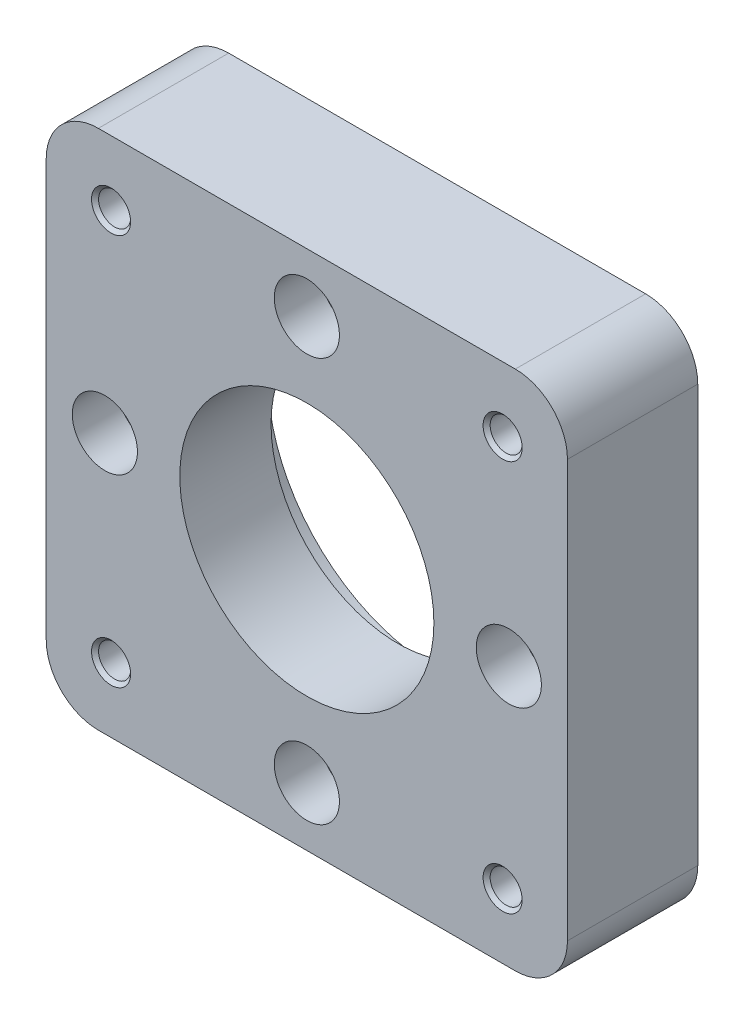
ISO-10303-21;
HEADER;
FILE_DESCRIPTION(('STEP AP214'),'2;1');
FILE_NAME('part.step','',(''),(''),'','','');
FILE_SCHEMA(('AUTOMOTIVE_DESIGN { 1 0 10303 214 1 1 1 1 }'));
ENDSEC;
DATA;
#1=APPLICATION_CONTEXT('core data for automotive mechanical design processes');
#2=APPLICATION_PROTOCOL_DEFINITION('international standard','automotive_design',2000,#1);
#3=PRODUCT_CONTEXT('',#1,'mechanical');
#4=PRODUCT('Part','Part','',(#3));
#5=PRODUCT_RELATED_PRODUCT_CATEGORY('part','',(#4));
#6=PRODUCT_DEFINITION_FORMATION('','',#4);
#7=PRODUCT_DEFINITION_CONTEXT('part definition',#1,'design');
#8=PRODUCT_DEFINITION('design','',#6,#7);
#9=PRODUCT_DEFINITION_SHAPE('','',#8);
#10=(LENGTH_UNIT() NAMED_UNIT(*) SI_UNIT(.MILLI.,.METRE.));
#11=(NAMED_UNIT(*) PLANE_ANGLE_UNIT() SI_UNIT($,.RADIAN.));
#12=(NAMED_UNIT(*) SI_UNIT($,.STERADIAN.) SOLID_ANGLE_UNIT());
#13=UNCERTAINTY_MEASURE_WITH_UNIT(LENGTH_MEASURE(1.E-05),#10,'distance_accuracy_value','');
#14=(GEOMETRIC_REPRESENTATION_CONTEXT(3) GLOBAL_UNCERTAINTY_ASSIGNED_CONTEXT((#13)) GLOBAL_UNIT_ASSIGNED_CONTEXT((#10,
#11,#12)) REPRESENTATION_CONTEXT('',''));
#15=CARTESIAN_POINT('',(0.,0.,0.));
#16=DIRECTION('',(0.,0.,1.));
#17=DIRECTION('',(1.,0.,0.));
#18=AXIS2_PLACEMENT_3D('',#15,#16,#17);
#19=CARTESIAN_POINT('',(-40.,-32.,-20.));
#20=DIRECTION('',(-1.,0.,0.));
#21=DIRECTION('',(0.,0.,1.));
#22=AXIS2_PLACEMENT_3D('',#19,#20,#21);
#23=PLANE('',#22);
#24=DIRECTION('',(0.,1.,0.));
#25=VECTOR('',#24,1.);
#26=CARTESIAN_POINT('',(-40.,-32.,0.));
#27=LINE('',#26,#25);
#28=CARTESIAN_POINT('',(-40.,32.,0.));
#29=VERTEX_POINT('',#28);
#30=CARTESIAN_POINT('',(-40.,-32.,0.));
#31=VERTEX_POINT('',#30);
#32=EDGE_CURVE('E83',#29,#31,#27,.F.);
#33=ORIENTED_EDGE('',*,*,#32,.F.);
#34=DIRECTION('',(0.,0.,-1.));
#35=VECTOR('',#34,1.);
#36=CARTESIAN_POINT('',(-40.,32.,0.));
#37=LINE('',#36,#35);
#38=CARTESIAN_POINT('',(-40.,32.,-20.));
#39=VERTEX_POINT('',#38);
#40=EDGE_CURVE('E95',#39,#29,#37,.F.);
#41=ORIENTED_EDGE('',*,*,#40,.F.);
#42=DIRECTION('',(0.,-1.,0.));
#43=VECTOR('',#42,1.);
#44=CARTESIAN_POINT('',(-40.,32.,-20.));
#45=LINE('',#44,#43);
#46=CARTESIAN_POINT('',(-40.,-32.,-20.));
#47=VERTEX_POINT('',#46);
#48=EDGE_CURVE('E100',#39,#47,#45,.T.);
#49=ORIENTED_EDGE('',*,*,#48,.T.);
#50=DIRECTION('',(0.,0.,1.));
#51=VECTOR('',#50,1.);
#52=CARTESIAN_POINT('',(-40.,-32.,-20.));
#53=LINE('',#52,#51);
#54=EDGE_CURVE('E97',#47,#31,#53,.T.);
#55=ORIENTED_EDGE('',*,*,#54,.T.);
#56=EDGE_LOOP('',(#33,#41,#49,#55));
#57=FACE_BOUND('',#56,.T.);
#58=ADVANCED_FACE('F17',(#57),#23,.T.);
#59=CARTESIAN_POINT('',(-31.9999999999987,-31.9999999999987,-20.));
#60=DIRECTION('',(0.,0.,1.));
#61=DIRECTION('',(-1.,-1.61526007705508E-13,0.));
#62=AXIS2_PLACEMENT_3D('',#59,#60,#61);
#63=CYLINDRICAL_SURFACE('',#62,8.00000000000131);
#64=CARTESIAN_POINT('',(-31.9999999999987,-31.9999999999987,0.));
#65=DIRECTION('',(0.,0.,-1.));
#66=DIRECTION('',(-1.62092561595246E-13,-1.,0.));
#67=AXIS2_PLACEMENT_3D('',#64,#65,#66);
#68=CIRCLE('',#67,8.00000000000131);
#69=CARTESIAN_POINT('',(-32.,-40.,0.));
#70=VERTEX_POINT('',#69);
#71=EDGE_CURVE('E111',#31,#70,#68,.F.);
#72=ORIENTED_EDGE('',*,*,#71,.F.);
#73=ORIENTED_EDGE('',*,*,#54,.F.);
#74=CARTESIAN_POINT('',(-31.9999999999987,-31.9999999999987,-20.));
#75=DIRECTION('',(0.,0.,1.));
#76=DIRECTION('',(-1.,-1.61648472385396E-13,0.));
#77=AXIS2_PLACEMENT_3D('',#74,#75,#76);
#78=CIRCLE('',#77,8.00000000000131);
#79=CARTESIAN_POINT('',(-32.,-40.,-20.));
#80=VERTEX_POINT('',#79);
#81=EDGE_CURVE('E115',#47,#80,#78,.T.);
#82=ORIENTED_EDGE('',*,*,#81,.T.);
#83=DIRECTION('',(0.,0.,1.));
#84=VECTOR('',#83,1.);
#85=CARTESIAN_POINT('',(-32.,-40.,-20.));
#86=LINE('',#85,#84);
#87=EDGE_CURVE('E120',#80,#70,#86,.T.);
#88=ORIENTED_EDGE('',*,*,#87,.T.);
#89=EDGE_LOOP('',(#72,#73,#82,#88));
#90=FACE_BOUND('',#89,.T.);
#91=ADVANCED_FACE('F345',(#90),#63,.T.);
#92=CARTESIAN_POINT('',(-32.,-40.,0.));
#93=DIRECTION('',(0.,-1.,0.));
#94=DIRECTION('',(0.,0.,-1.));
#95=AXIS2_PLACEMENT_3D('',#92,#93,#94);
#96=PLANE('',#95);
#97=DIRECTION('',(-1.,0.,0.));
#98=VECTOR('',#97,1.);
#99=CARTESIAN_POINT('',(32.,-40.,0.));
#100=LINE('',#99,#98);
#101=CARTESIAN_POINT('',(32.,-40.,0.));
#102=VERTEX_POINT('',#101);
#103=EDGE_CURVE('E125',#70,#102,#100,.F.);
#104=ORIENTED_EDGE('',*,*,#103,.F.);
#105=ORIENTED_EDGE('',*,*,#87,.F.);
#106=DIRECTION('',(1.,0.,0.));
#107=VECTOR('',#106,1.);
#108=CARTESIAN_POINT('',(-32.,-40.,-20.));
#109=LINE('',#108,#107);
#110=CARTESIAN_POINT('',(32.,-40.,-20.));
#111=VERTEX_POINT('',#110);
#112=EDGE_CURVE('E129',#80,#111,#109,.T.);
#113=ORIENTED_EDGE('',*,*,#112,.T.);
#114=DIRECTION('',(0.,0.,1.));
#115=VECTOR('',#114,1.);
#116=CARTESIAN_POINT('',(32.,-40.,-20.));
#117=LINE('',#116,#115);
#118=EDGE_CURVE('E134',#111,#102,#117,.T.);
#119=ORIENTED_EDGE('',*,*,#118,.T.);
#120=EDGE_LOOP('',(#104,#105,#113,#119));
#121=FACE_BOUND('',#120,.T.);
#122=ADVANCED_FACE('F350',(#121),#96,.T.);
#123=CARTESIAN_POINT('',(31.9999999999987,-31.9999999999987,-20.));
#124=DIRECTION('',(0.,0.,1.));
#125=DIRECTION('',(1.61464775365551E-13,-1.,0.));
#126=AXIS2_PLACEMENT_3D('',#123,#124,#125);
#127=CYLINDRICAL_SURFACE('',#126,8.00000000000131);
#128=CARTESIAN_POINT('',(31.9999999999987,-31.9999999999987,0.));
#129=DIRECTION('',(0.,0.,-1.));
#130=DIRECTION('',(1.,0.,0.));
#131=AXIS2_PLACEMENT_3D('',#128,#129,#130);
#132=CIRCLE('',#131,8.00000000000131);
#133=CARTESIAN_POINT('',(40.,-31.9999999999994,0.));
#134=VERTEX_POINT('',#133);
#135=EDGE_CURVE('E139',#102,#134,#132,.F.);
#136=ORIENTED_EDGE('',*,*,#135,.F.);
#137=ORIENTED_EDGE('',*,*,#118,.F.);
#138=CARTESIAN_POINT('',(31.9999999999987,-31.9999999999987,-20.));
#139=DIRECTION('',(0.,0.,1.));
#140=DIRECTION('',(1.62980740014946E-13,-1.,0.));
#141=AXIS2_PLACEMENT_3D('',#138,#139,#140);
#142=CIRCLE('',#141,8.00000000000131);
#143=CARTESIAN_POINT('',(40.,-31.9999999999992,-20.));
#144=VERTEX_POINT('',#143);
#145=EDGE_CURVE('E143',#111,#144,#142,.T.);
#146=ORIENTED_EDGE('',*,*,#145,.T.);
#147=DIRECTION('',(0.,0.,1.));
#148=VECTOR('',#147,1.);
#149=CARTESIAN_POINT('',(40.,-31.9999999999992,-20.));
#150=LINE('',#149,#148);
#151=EDGE_CURVE('E148',#144,#134,#150,.T.);
#152=ORIENTED_EDGE('',*,*,#151,.T.);
#153=EDGE_LOOP('',(#136,#137,#146,#152));
#154=FACE_BOUND('',#153,.T.);
#155=ADVANCED_FACE('F356',(#154),#127,.T.);
#156=CARTESIAN_POINT('',(40.,-32.,0.));
#157=DIRECTION('',(1.,0.,0.));
#158=DIRECTION('',(0.,0.,-1.));
#159=AXIS2_PLACEMENT_3D('',#156,#157,#158);
#160=PLANE('',#159);
#161=DIRECTION('',(0.,-1.,0.));
#162=VECTOR('',#161,1.);
#163=CARTESIAN_POINT('',(40.,31.9999999999999,0.));
#164=LINE('',#163,#162);
#165=CARTESIAN_POINT('',(40.,31.9999999999999,0.));
#166=VERTEX_POINT('',#165);
#167=EDGE_CURVE('E153',#134,#166,#164,.F.);
#168=ORIENTED_EDGE('',*,*,#167,.F.);
#169=ORIENTED_EDGE('',*,*,#151,.F.);
#170=DIRECTION('',(0.,1.,0.));
#171=VECTOR('',#170,1.);
#172=CARTESIAN_POINT('',(40.,-31.9999999999992,-20.));
#173=LINE('',#172,#171);
#174=CARTESIAN_POINT('',(40.,31.9999999999999,-20.));
#175=VERTEX_POINT('',#174);
#176=EDGE_CURVE('E157',#144,#175,#173,.T.);
#177=ORIENTED_EDGE('',*,*,#176,.T.);
#178=DIRECTION('',(0.,0.,1.));
#179=VECTOR('',#178,1.);
#180=CARTESIAN_POINT('',(40.,31.9999999999999,-20.));
#181=LINE('',#180,#179);
#182=EDGE_CURVE('E162',#175,#166,#181,.T.);
#183=ORIENTED_EDGE('',*,*,#182,.T.);
#184=EDGE_LOOP('',(#168,#169,#177,#183));
#185=FACE_BOUND('',#184,.T.);
#186=ADVANCED_FACE('F360',(#185),#160,.T.);
#187=CARTESIAN_POINT('',(31.9999999999987,31.9999999999987,-20.));
#188=DIRECTION('',(0.,0.,1.));
#189=DIRECTION('',(1.,0.,0.));
#190=AXIS2_PLACEMENT_3D('',#187,#188,#189);
#191=CYLINDRICAL_SURFACE('',#190,8.00000000000131);
#192=CARTESIAN_POINT('',(31.9999999999987,31.9999999999987,0.));
#193=DIRECTION('',(0.,0.,-1.));
#194=DIRECTION('',(1.61648472385396E-13,1.,0.));
#195=AXIS2_PLACEMENT_3D('',#192,#193,#194);
#196=CIRCLE('',#195,8.00000000000131);
#197=CARTESIAN_POINT('',(32.,40.,0.));
#198=VERTEX_POINT('',#197);
#199=EDGE_CURVE('E167',#166,#198,#196,.F.);
#200=ORIENTED_EDGE('',*,*,#199,.F.);
#201=ORIENTED_EDGE('',*,*,#182,.F.);
#202=CARTESIAN_POINT('',(31.9999999999987,31.9999999999987,-20.));
#203=DIRECTION('',(0.,0.,1.));
#204=DIRECTION('',(1.,1.49658063719447E-13,0.));
#205=AXIS2_PLACEMENT_3D('',#202,#203,#204);
#206=CIRCLE('',#205,8.00000000000131);
#207=CARTESIAN_POINT('',(32.,40.,-20.));
#208=VERTEX_POINT('',#207);
#209=EDGE_CURVE('E171',#175,#208,#206,.T.);
#210=ORIENTED_EDGE('',*,*,#209,.T.);
#211=DIRECTION('',(0.,0.,1.));
#212=VECTOR('',#211,1.);
#213=CARTESIAN_POINT('',(32.,40.,-20.));
#214=LINE('',#213,#212);
#215=EDGE_CURVE('E176',#208,#198,#214,.T.);
#216=ORIENTED_EDGE('',*,*,#215,.T.);
#217=EDGE_LOOP('',(#200,#201,#210,#216));
#218=FACE_BOUND('',#217,.T.);
#219=ADVANCED_FACE('F364',(#218),#191,.T.);
#220=CARTESIAN_POINT('',(-32.,40.,-20.));
#221=DIRECTION('',(0.,1.,0.));
#222=DIRECTION('',(0.,0.,1.));
#223=AXIS2_PLACEMENT_3D('',#220,#221,#222);
#224=PLANE('',#223);
#225=DIRECTION('',(1.,0.,0.));
#226=VECTOR('',#225,1.);
#227=CARTESIAN_POINT('',(-32.,40.,0.));
#228=LINE('',#227,#226);
#229=CARTESIAN_POINT('',(-32.,40.,0.));
#230=VERTEX_POINT('',#229);
#231=EDGE_CURVE('E32',#198,#230,#228,.F.);
#232=ORIENTED_EDGE('',*,*,#231,.F.);
#233=ORIENTED_EDGE('',*,*,#215,.F.);
#234=DIRECTION('',(-1.,0.,0.));
#235=VECTOR('',#234,1.);
#236=CARTESIAN_POINT('',(32.,40.,-20.));
#237=LINE('',#236,#235);
#238=CARTESIAN_POINT('',(-32.,40.,-20.));
#239=VERTEX_POINT('',#238);
#240=EDGE_CURVE('E184',#208,#239,#237,.T.);
#241=ORIENTED_EDGE('',*,*,#240,.T.);
#242=DIRECTION('',(0.,0.,1.));
#243=VECTOR('',#242,1.);
#244=CARTESIAN_POINT('',(-32.,40.,-20.));
#245=LINE('',#244,#243);
#246=EDGE_CURVE('E89',#239,#230,#245,.T.);
#247=ORIENTED_EDGE('',*,*,#246,.T.);
#248=EDGE_LOOP('',(#232,#233,#241,#247));
#249=FACE_BOUND('',#248,.T.);
#250=ADVANCED_FACE('F368',(#249),#224,.T.);
#251=CARTESIAN_POINT('',(-31.9999999999987,31.9999999999987,-20.));
#252=DIRECTION('',(0.,0.,1.));
#253=DIRECTION('',(-1.62031329255315E-13,1.,0.));
#254=AXIS2_PLACEMENT_3D('',#251,#252,#253);
#255=CYLINDRICAL_SURFACE('',#254,8.00000000000131);
#256=CARTESIAN_POINT('',(-31.9999999999987,31.9999999999987,0.));
#257=DIRECTION('',(0.,0.,-1.));
#258=DIRECTION('',(-1.,1.61648472385396E-13,0.));
#259=AXIS2_PLACEMENT_3D('',#256,#257,#258);
#260=CIRCLE('',#259,8.00000000000131);
#261=EDGE_CURVE('E79',#230,#29,#260,.F.);
#262=ORIENTED_EDGE('',*,*,#261,.F.);
#263=ORIENTED_EDGE('',*,*,#246,.F.);
#264=CARTESIAN_POINT('',(-31.9999999999987,31.9999999999987,-20.));
#265=DIRECTION('',(0.,0.,1.));
#266=DIRECTION('',(-1.62092561595246E-13,1.,0.));
#267=AXIS2_PLACEMENT_3D('',#264,#265,#266);
#268=CIRCLE('',#267,8.00000000000131);
#269=EDGE_CURVE('E40',#239,#39,#268,.T.);
#270=ORIENTED_EDGE('',*,*,#269,.T.);
#271=ORIENTED_EDGE('',*,*,#40,.T.);
#272=EDGE_LOOP('',(#262,#263,#270,#271));
#273=FACE_BOUND('',#272,.T.);
#274=ADVANCED_FACE('F99',(#273),#255,.T.);
#275=CARTESIAN_POINT('',(-40.,-40.,-20.));
#276=DIRECTION('',(0.,0.,-1.));
#277=DIRECTION('',(0.,1.,0.));
#278=AXIS2_PLACEMENT_3D('',#275,#276,#277);
#279=PLANE('',#278);
#280=ORIENTED_EDGE('',*,*,#48,.F.);
#281=ORIENTED_EDGE('',*,*,#269,.F.);
#282=ORIENTED_EDGE('',*,*,#240,.F.);
#283=ORIENTED_EDGE('',*,*,#209,.F.);
#284=ORIENTED_EDGE('',*,*,#176,.F.);
#285=ORIENTED_EDGE('',*,*,#145,.F.);
#286=ORIENTED_EDGE('',*,*,#112,.F.);
#287=ORIENTED_EDGE('',*,*,#81,.F.);
#288=EDGE_LOOP('',(#280,#281,#282,#283,#284,#285,#286,#287));
#289=FACE_BOUND('',#288,.T.);
#290=CARTESIAN_POINT('',(0.,0.,-20.));
#291=DIRECTION('',(0.,0.,1.));
#292=DIRECTION('',(-1.,0.,0.));
#293=AXIS2_PLACEMENT_3D('',#290,#291,#292);
#294=CIRCLE('',#293,26.);
#295=CARTESIAN_POINT('',(-26.,0.,-20.));
#296=VERTEX_POINT('',#295);
#297=EDGE_CURVE('E196',#296,#296,#294,.F.);
#298=ORIENTED_EDGE('',*,*,#297,.F.);
#299=EDGE_LOOP('',(#298));
#300=FACE_BOUND('',#299,.T.);
#301=CARTESIAN_POINT('',(-30.05,-30.05,-20.));
#302=DIRECTION('',(0.,0.,1.));
#303=DIRECTION('',(-1.,0.,0.));
#304=AXIS2_PLACEMENT_3D('',#301,#302,#303);
#305=CIRCLE('',#304,5.5);
#306=CARTESIAN_POINT('',(-35.55,-30.05,-20.));
#307=VERTEX_POINT('',#306);
#308=EDGE_CURVE('E201',#307,#307,#305,.T.);
#309=ORIENTED_EDGE('',*,*,#308,.T.);
#310=EDGE_LOOP('',(#309));
#311=FACE_BOUND('',#310,.T.);
#312=CARTESIAN_POINT('',(30.05,-30.05,-20.));
#313=DIRECTION('',(0.,0.,1.));
#314=DIRECTION('',(-1.,-1.16865482947436E-09,0.));
#315=AXIS2_PLACEMENT_3D('',#312,#313,#314);
#316=CIRCLE('',#315,5.5);
#317=CARTESIAN_POINT('',(24.55,-30.0500000064276,-20.));
#318=VERTEX_POINT('',#317);
#319=EDGE_CURVE('E204',#318,#318,#316,.T.);
#320=ORIENTED_EDGE('',*,*,#319,.T.);
#321=EDGE_LOOP('',(#320));
#322=FACE_BOUND('',#321,.T.);
#323=CARTESIAN_POINT('',(-30.05,30.05,-20.));
#324=DIRECTION('',(0.,0.,1.));
#325=DIRECTION('',(-1.,0.,0.));
#326=AXIS2_PLACEMENT_3D('',#323,#324,#325);
#327=CIRCLE('',#326,5.5);
#328=CARTESIAN_POINT('',(-35.55,30.05,-20.));
#329=VERTEX_POINT('',#328);
#330=EDGE_CURVE('E207',#329,#329,#327,.T.);
#331=ORIENTED_EDGE('',*,*,#330,.T.);
#332=EDGE_LOOP('',(#331));
#333=FACE_BOUND('',#332,.T.);
#334=CARTESIAN_POINT('',(30.05,30.05,-20.));
#335=DIRECTION('',(0.,0.,1.));
#336=DIRECTION('',(-1.,-1.16865482947436E-09,0.));
#337=AXIS2_PLACEMENT_3D('',#334,#335,#336);
#338=CIRCLE('',#337,5.5);
#339=CARTESIAN_POINT('',(24.55,30.0499999935724,-20.));
#340=VERTEX_POINT('',#339);
#341=EDGE_CURVE('E210',#340,#340,#338,.T.);
#342=ORIENTED_EDGE('',*,*,#341,.T.);
#343=EDGE_LOOP('',(#342));
#344=FACE_BOUND('',#343,.T.);
#345=CARTESIAN_POINT('',(0.,-31.,-20.));
#346=DIRECTION('',(0.,0.,1.));
#347=DIRECTION('',(-1.,0.,0.));
#348=AXIS2_PLACEMENT_3D('',#345,#346,#347);
#349=CIRCLE('',#348,2.75);
#350=CARTESIAN_POINT('',(-2.75,-31.,-20.));
#351=VERTEX_POINT('',#350);
#352=EDGE_CURVE('E213',#351,#351,#349,.T.);
#353=ORIENTED_EDGE('',*,*,#352,.T.);
#354=EDGE_LOOP('',(#353));
#355=FACE_BOUND('',#354,.T.);
#356=CARTESIAN_POINT('',(31.,0.,-20.));
#357=DIRECTION('',(0.,0.,1.));
#358=DIRECTION('',(-0.99999999999999,1.42053899956164E-07,0.));
#359=AXIS2_PLACEMENT_3D('',#356,#357,#358);
#360=CIRCLE('',#359,2.75);
#361=CARTESIAN_POINT('',(28.25,3.90648224879452E-07,-20.));
#362=VERTEX_POINT('',#361);
#363=EDGE_CURVE('E216',#362,#362,#360,.T.);
#364=ORIENTED_EDGE('',*,*,#363,.T.);
#365=EDGE_LOOP('',(#364));
#366=FACE_BOUND('',#365,.T.);
#367=CARTESIAN_POINT('',(0.,31.,-20.));
#368=DIRECTION('',(0.,0.,1.));
#369=DIRECTION('',(-0.99999999999999,-1.42053915458916E-07,0.));
#370=AXIS2_PLACEMENT_3D('',#367,#368,#369);
#371=CIRCLE('',#370,2.75);
#372=CARTESIAN_POINT('',(-2.74999999999997,30.9999996093517,-20.));
#373=VERTEX_POINT('',#372);
#374=EDGE_CURVE('E219',#373,#373,#371,.T.);
#375=ORIENTED_EDGE('',*,*,#374,.T.);
#376=EDGE_LOOP('',(#375));
#377=FACE_BOUND('',#376,.T.);
#378=CARTESIAN_POINT('',(-31.,0.,-20.));
#379=DIRECTION('',(0.,0.,1.));
#380=DIRECTION('',(-1.,0.,0.));
#381=AXIS2_PLACEMENT_3D('',#378,#379,#380);
#382=CIRCLE('',#381,2.75);
#383=CARTESIAN_POINT('',(-33.75,0.,-20.));
#384=VERTEX_POINT('',#383);
#385=EDGE_CURVE('E222',#384,#384,#382,.T.);
#386=ORIENTED_EDGE('',*,*,#385,.T.);
#387=EDGE_LOOP('',(#386));
#388=FACE_BOUND('',#387,.T.);
#389=ADVANCED_FACE('F375',(#289,#300,#311,#322,#333,#344,#355,#366,#377,#388),#279,.T.);
#390=CARTESIAN_POINT('',(-40.,-40.,0.));
#391=DIRECTION('',(0.,0.,1.));
#392=DIRECTION('',(1.,0.,0.));
#393=AXIS2_PLACEMENT_3D('',#390,#391,#392);
#394=PLANE('',#393);
#395=ORIENTED_EDGE('',*,*,#32,.T.);
#396=ORIENTED_EDGE('',*,*,#71,.T.);
#397=ORIENTED_EDGE('',*,*,#103,.T.);
#398=ORIENTED_EDGE('',*,*,#135,.T.);
#399=ORIENTED_EDGE('',*,*,#167,.T.);
#400=ORIENTED_EDGE('',*,*,#199,.T.);
#401=ORIENTED_EDGE('',*,*,#231,.T.);
#402=ORIENTED_EDGE('',*,*,#261,.T.);
#403=EDGE_LOOP('',(#395,#396,#397,#398,#399,#400,#401,#402));
#404=FACE_BOUND('',#403,.T.);
#405=CARTESIAN_POINT('',(0.,0.,0.));
#406=DIRECTION('',(0.,0.,-1.));
#407=DIRECTION('',(1.,0.,0.));
#408=AXIS2_PLACEMENT_3D('',#405,#406,#407);
#409=CIRCLE('',#408,19.5);
#410=CARTESIAN_POINT('',(19.5,0.,0.));
#411=VERTEX_POINT('',#410);
#412=EDGE_CURVE('E225',#411,#411,#409,.T.);
#413=ORIENTED_EDGE('',*,*,#412,.T.);
#414=EDGE_LOOP('',(#413));
#415=FACE_BOUND('',#414,.T.);
#416=CARTESIAN_POINT('',(0.,-31.,0.));
#417=DIRECTION('',(0.,0.,-1.));
#418=DIRECTION('',(1.,0.,0.));
#419=AXIS2_PLACEMENT_3D('',#416,#417,#418);
#420=CIRCLE('',#419,5.);
#421=CARTESIAN_POINT('',(5.,-31.,0.));
#422=VERTEX_POINT('',#421);
#423=EDGE_CURVE('E228',#422,#422,#420,.F.);
#424=ORIENTED_EDGE('',*,*,#423,.F.);
#425=EDGE_LOOP('',(#424));
#426=FACE_BOUND('',#425,.T.);
#427=CARTESIAN_POINT('',(31.,0.,0.));
#428=DIRECTION('',(0.,0.,-1.));
#429=DIRECTION('',(1.,0.,0.));
#430=AXIS2_PLACEMENT_3D('',#427,#428,#429);
#431=CIRCLE('',#430,5.);
#432=CARTESIAN_POINT('',(36.,0.,0.));
#433=VERTEX_POINT('',#432);
#434=EDGE_CURVE('E231',#433,#433,#431,.F.);
#435=ORIENTED_EDGE('',*,*,#434,.F.);
#436=EDGE_LOOP('',(#435));
#437=FACE_BOUND('',#436,.T.);
#438=CARTESIAN_POINT('',(0.,31.,0.));
#439=DIRECTION('',(0.,0.,-1.));
#440=DIRECTION('',(1.,0.,0.));
#441=AXIS2_PLACEMENT_3D('',#438,#439,#440);
#442=CIRCLE('',#441,5.);
#443=CARTESIAN_POINT('',(5.,31.,0.));
#444=VERTEX_POINT('',#443);
#445=EDGE_CURVE('E234',#444,#444,#442,.F.);
#446=ORIENTED_EDGE('',*,*,#445,.F.);
#447=EDGE_LOOP('',(#446));
#448=FACE_BOUND('',#447,.T.);
#449=CARTESIAN_POINT('',(-31.,0.,0.));
#450=DIRECTION('',(0.,0.,-1.));
#451=DIRECTION('',(1.,0.,0.));
#452=AXIS2_PLACEMENT_3D('',#449,#450,#451);
#453=CIRCLE('',#452,5.);
#454=CARTESIAN_POINT('',(-26.,0.,0.));
#455=VERTEX_POINT('',#454);
#456=EDGE_CURVE('E237',#455,#455,#453,.F.);
#457=ORIENTED_EDGE('',*,*,#456,.F.);
#458=EDGE_LOOP('',(#457));
#459=FACE_BOUND('',#458,.T.);
#460=CARTESIAN_POINT('',(-30.05,30.05,0.));
#461=DIRECTION('',(0.,0.,-1.));
#462=DIRECTION('',(0.99999999999999,-1.4205399286501E-07,0.));
#463=AXIS2_PLACEMENT_3D('',#460,#461,#462);
#464=CIRCLE('',#463,3.);
#465=CARTESIAN_POINT('',(-27.05,30.049999573838,0.));
#466=VERTEX_POINT('',#465);
#467=EDGE_CURVE('E240',#466,#466,#464,.T.);
#468=ORIENTED_EDGE('',*,*,#467,.T.);
#469=EDGE_LOOP('',(#468));
#470=FACE_BOUND('',#469,.T.);
#471=CARTESIAN_POINT('',(30.05,-30.05,0.));
#472=DIRECTION('',(0.,0.,-1.));
#473=DIRECTION('',(0.99999999999999,-1.42053992865012E-07,0.));
#474=AXIS2_PLACEMENT_3D('',#471,#472,#473);
#475=CIRCLE('',#474,3.);
#476=CARTESIAN_POINT('',(33.05,-30.050000426162,0.));
#477=VERTEX_POINT('',#476);
#478=EDGE_CURVE('E243',#477,#477,#475,.T.);
#479=ORIENTED_EDGE('',*,*,#478,.T.);
#480=EDGE_LOOP('',(#479));
#481=FACE_BOUND('',#480,.T.);
#482=CARTESIAN_POINT('',(30.05,30.05,0.));
#483=DIRECTION('',(0.,0.,-1.));
#484=DIRECTION('',(0.99999999999999,-1.42053997601963E-07,0.));
#485=AXIS2_PLACEMENT_3D('',#482,#483,#484);
#486=CIRCLE('',#485,3.);
#487=CARTESIAN_POINT('',(33.05,30.049999573838,0.));
#488=VERTEX_POINT('',#487);
#489=EDGE_CURVE('E246',#488,#488,#486,.T.);
#490=ORIENTED_EDGE('',*,*,#489,.T.);
#491=EDGE_LOOP('',(#490));
#492=FACE_BOUND('',#491,.T.);
#493=CARTESIAN_POINT('',(-30.05,-30.05,0.));
#494=DIRECTION('',(0.,0.,-1.));
#495=DIRECTION('',(0.99999999999999,-1.42053862598842E-07,0.));
#496=AXIS2_PLACEMENT_3D('',#493,#494,#495);
#497=CIRCLE('',#496,3.);
#498=CARTESIAN_POINT('',(-27.05,-30.0500004261616,0.));
#499=VERTEX_POINT('',#498);
#500=EDGE_CURVE('E249',#499,#499,#497,.T.);
#501=ORIENTED_EDGE('',*,*,#500,.T.);
#502=EDGE_LOOP('',(#501));
#503=FACE_BOUND('',#502,.T.);
#504=ADVANCED_FACE('F81',(#404,#415,#426,#437,#448,#459,#470,#481,#492,#503),#394,.T.);
#505=CARTESIAN_POINT('',(-35.55,24.5500000065772,-13.));
#506=DIRECTION('',(0.,0.,-1.));
#507=DIRECTION('',(0.,1.,0.));
#508=AXIS2_PLACEMENT_3D('',#505,#506,#507);
#509=PLANE('',#508);
#510=CARTESIAN_POINT('',(-30.05,30.05,-13.));
#511=DIRECTION('',(0.,0.,-1.));
#512=DIRECTION('',(1.,-1.16865482947436E-09,0.));
#513=AXIS2_PLACEMENT_3D('',#510,#511,#512);
#514=CIRCLE('',#513,5.5);
#515=CARTESIAN_POINT('',(-24.55,30.0499999935724,-13.));
#516=VERTEX_POINT('',#515);
#517=EDGE_CURVE('E252',#516,#516,#514,.F.);
#518=ORIENTED_EDGE('',*,*,#517,.F.);
#519=EDGE_LOOP('',(#518));
#520=FACE_BOUND('',#519,.T.);
#521=CARTESIAN_POINT('',(-30.05,30.05,-13.));
#522=DIRECTION('',(0.,0.,1.));
#523=DIRECTION('',(-1.,0.,0.));
#524=AXIS2_PLACEMENT_3D('',#521,#522,#523);
#525=CIRCLE('',#524,3.);
#526=CARTESIAN_POINT('',(-33.05,30.05,-13.));
#527=VERTEX_POINT('',#526);
#528=EDGE_CURVE('E255',#527,#527,#525,.F.);
#529=ORIENTED_EDGE('',*,*,#528,.F.);
#530=EDGE_LOOP('',(#529));
#531=FACE_BOUND('',#530,.T.);
#532=ADVANCED_FACE('F380',(#520,#531),#509,.T.);
#533=CARTESIAN_POINT('',(24.55,-35.55,-13.));
#534=DIRECTION('',(0.,0.,-1.));
#535=DIRECTION('',(0.,1.,0.));
#536=AXIS2_PLACEMENT_3D('',#533,#534,#535);
#537=PLANE('',#536);
#538=CARTESIAN_POINT('',(30.05,-30.05,-13.));
#539=DIRECTION('',(0.,0.,-1.));
#540=DIRECTION('',(1.,0.,0.));
#541=AXIS2_PLACEMENT_3D('',#538,#539,#540);
#542=CIRCLE('',#541,5.5);
#543=CARTESIAN_POINT('',(35.55,-30.05,-13.));
#544=VERTEX_POINT('',#543);
#545=EDGE_CURVE('E258',#544,#544,#542,.F.);
#546=ORIENTED_EDGE('',*,*,#545,.F.);
#547=EDGE_LOOP('',(#546));
#548=FACE_BOUND('',#547,.T.);
#549=CARTESIAN_POINT('',(30.05,-30.05,-13.));
#550=DIRECTION('',(0.,0.,1.));
#551=DIRECTION('',(-1.,0.,0.));
#552=AXIS2_PLACEMENT_3D('',#549,#550,#551);
#553=CIRCLE('',#552,3.);
#554=CARTESIAN_POINT('',(27.05,-30.05,-13.));
#555=VERTEX_POINT('',#554);
#556=EDGE_CURVE('E261',#555,#555,#553,.F.);
#557=ORIENTED_EDGE('',*,*,#556,.F.);
#558=EDGE_LOOP('',(#557));
#559=FACE_BOUND('',#558,.T.);
#560=ADVANCED_FACE('F383',(#548,#559),#537,.T.);
#561=CARTESIAN_POINT('',(-35.55,-35.5499999934258,-13.));
#562=DIRECTION('',(0.,0.,-1.));
#563=DIRECTION('',(0.,1.,0.));
#564=AXIS2_PLACEMENT_3D('',#561,#562,#563);
#565=PLANE('',#564);
#566=CARTESIAN_POINT('',(-30.05,-30.05,-13.));
#567=DIRECTION('',(0.,0.,-1.));
#568=DIRECTION('',(1.,-1.16812709000607E-09,0.));
#569=AXIS2_PLACEMENT_3D('',#566,#567,#568);
#570=CIRCLE('',#569,5.5);
#571=CARTESIAN_POINT('',(-24.55,-30.0500000064247,-13.));
#572=VERTEX_POINT('',#571);
#573=EDGE_CURVE('E264',#572,#572,#570,.F.);
#574=ORIENTED_EDGE('',*,*,#573,.F.);
#575=EDGE_LOOP('',(#574));
#576=FACE_BOUND('',#575,.T.);
#577=CARTESIAN_POINT('',(-30.05,-30.05,-13.));
#578=DIRECTION('',(0.,0.,1.));
#579=DIRECTION('',(-1.,0.,0.));
#580=AXIS2_PLACEMENT_3D('',#577,#578,#579);
#581=CIRCLE('',#580,3.);
#582=CARTESIAN_POINT('',(-33.05,-30.05,-13.));
#583=VERTEX_POINT('',#582);
#584=EDGE_CURVE('E267',#583,#583,#581,.F.);
#585=ORIENTED_EDGE('',*,*,#584,.F.);
#586=EDGE_LOOP('',(#585));
#587=FACE_BOUND('',#586,.T.);
#588=ADVANCED_FACE('F387',(#576,#587),#565,.T.);
#589=CARTESIAN_POINT('',(24.55,24.55,-13.));
#590=DIRECTION('',(0.,0.,-1.));
#591=DIRECTION('',(0.,1.,0.));
#592=AXIS2_PLACEMENT_3D('',#589,#590,#591);
#593=PLANE('',#592);
#594=CARTESIAN_POINT('',(30.05,30.05,-13.));
#595=DIRECTION('',(0.,0.,-1.));
#596=DIRECTION('',(1.,0.,0.));
#597=AXIS2_PLACEMENT_3D('',#594,#595,#596);
#598=CIRCLE('',#597,5.5);
#599=CARTESIAN_POINT('',(35.55,30.05,-13.));
#600=VERTEX_POINT('',#599);
#601=EDGE_CURVE('E270',#600,#600,#598,.F.);
#602=ORIENTED_EDGE('',*,*,#601,.F.);
#603=EDGE_LOOP('',(#602));
#604=FACE_BOUND('',#603,.T.);
#605=CARTESIAN_POINT('',(30.05,30.05,-13.));
#606=DIRECTION('',(0.,0.,1.));
#607=DIRECTION('',(-1.,0.,0.));
#608=AXIS2_PLACEMENT_3D('',#605,#606,#607);
#609=CIRCLE('',#608,3.);
#610=CARTESIAN_POINT('',(27.05,30.05,-13.));
#611=VERTEX_POINT('',#610);
#612=EDGE_CURVE('E273',#611,#611,#609,.F.);
#613=ORIENTED_EDGE('',*,*,#612,.F.);
#614=EDGE_LOOP('',(#613));
#615=FACE_BOUND('',#614,.T.);
#616=ADVANCED_FACE('F391',(#604,#615),#593,.T.);
#617=CARTESIAN_POINT('',(-5.00000038389405,26.0000002422889,-7.));
#618=DIRECTION('',(0.,0.,1.));
#619=DIRECTION('',(1.,0.,0.));
#620=AXIS2_PLACEMENT_3D('',#617,#618,#619);
#621=PLANE('',#620);
#622=CARTESIAN_POINT('',(0.,31.,-7.));
#623=DIRECTION('',(0.,0.,1.));
#624=DIRECTION('',(-0.99999999999999,-1.42067199249141E-07,0.));
#625=AXIS2_PLACEMENT_3D('',#622,#623,#624);
#626=CIRCLE('',#625,5.);
#627=CARTESIAN_POINT('',(-4.99999999999995,30.999999289664,-7.));
#628=VERTEX_POINT('',#627);
#629=EDGE_CURVE('E276',#628,#628,#626,.T.);
#630=ORIENTED_EDGE('',*,*,#629,.T.);
#631=EDGE_LOOP('',(#630));
#632=FACE_BOUND('',#631,.T.);
#633=CARTESIAN_POINT('',(0.,31.,-7.));
#634=DIRECTION('',(0.,0.,-1.));
#635=DIRECTION('',(1.,0.,0.));
#636=AXIS2_PLACEMENT_3D('',#633,#634,#635);
#637=CIRCLE('',#636,2.75);
#638=CARTESIAN_POINT('',(2.75,31.,-7.));
#639=VERTEX_POINT('',#638);
#640=EDGE_CURVE('E279',#639,#639,#637,.T.);
#641=ORIENTED_EDGE('',*,*,#640,.T.);
#642=EDGE_LOOP('',(#641));
#643=FACE_BOUND('',#642,.T.);
#644=ADVANCED_FACE('F395',(#632,#643),#621,.T.);
#645=CARTESIAN_POINT('',(-36.0000003838944,-4.99999975771087,-7.));
#646=DIRECTION('',(0.,0.,1.));
#647=DIRECTION('',(1.,0.,0.));
#648=AXIS2_PLACEMENT_3D('',#645,#646,#647);
#649=PLANE('',#648);
#650=CARTESIAN_POINT('',(-31.,0.,-7.));
#651=DIRECTION('',(0.,0.,1.));
#652=DIRECTION('',(-0.99999999999999,-1.42067316311057E-07,0.));
#653=AXIS2_PLACEMENT_3D('',#650,#651,#652);
#654=CIRCLE('',#653,5.);
#655=CARTESIAN_POINT('',(-36.,-7.10336581555285E-07,-7.));
#656=VERTEX_POINT('',#655);
#657=EDGE_CURVE('E282',#656,#656,#654,.T.);
#658=ORIENTED_EDGE('',*,*,#657,.T.);
#659=EDGE_LOOP('',(#658));
#660=FACE_BOUND('',#659,.T.);
#661=CARTESIAN_POINT('',(-31.,0.,-7.));
#662=DIRECTION('',(0.,0.,-1.));
#663=DIRECTION('',(1.,0.,0.));
#664=AXIS2_PLACEMENT_3D('',#661,#662,#663);
#665=CIRCLE('',#664,2.75);
#666=CARTESIAN_POINT('',(-28.25,0.,-7.));
#667=VERTEX_POINT('',#666);
#668=EDGE_CURVE('E285',#667,#667,#665,.T.);
#669=ORIENTED_EDGE('',*,*,#668,.T.);
#670=EDGE_LOOP('',(#669));
#671=FACE_BOUND('',#670,.T.);
#672=ADVANCED_FACE('F399',(#660,#671),#649,.T.);
#673=CARTESIAN_POINT('',(-5.00000038389405,-35.9999997577111,-7.));
#674=DIRECTION('',(0.,0.,1.));
#675=DIRECTION('',(1.,0.,0.));
#676=AXIS2_PLACEMENT_3D('',#673,#674,#675);
#677=PLANE('',#676);
#678=CARTESIAN_POINT('',(0.,-31.,-7.));
#679=DIRECTION('',(0.,0.,1.));
#680=DIRECTION('',(-0.99999999999999,-1.42067199249141E-07,0.));
#681=AXIS2_PLACEMENT_3D('',#678,#679,#680);
#682=CIRCLE('',#681,5.);
#683=CARTESIAN_POINT('',(-4.99999999999995,-31.000000710336,-7.));
#684=VERTEX_POINT('',#683);
#685=EDGE_CURVE('E288',#684,#684,#682,.T.);
#686=ORIENTED_EDGE('',*,*,#685,.T.);
#687=EDGE_LOOP('',(#686));
#688=FACE_BOUND('',#687,.T.);
#689=CARTESIAN_POINT('',(0.,-31.,-7.));
#690=DIRECTION('',(0.,0.,-1.));
#691=DIRECTION('',(1.,0.,0.));
#692=AXIS2_PLACEMENT_3D('',#689,#690,#691);
#693=CIRCLE('',#692,2.75);
#694=CARTESIAN_POINT('',(2.75,-31.,-7.));
#695=VERTEX_POINT('',#694);
#696=EDGE_CURVE('E291',#695,#695,#693,.T.);
#697=ORIENTED_EDGE('',*,*,#696,.T.);
#698=EDGE_LOOP('',(#697));
#699=FACE_BOUND('',#698,.T.);
#700=ADVANCED_FACE('F403',(#688,#699),#677,.T.);
#701=CARTESIAN_POINT('',(25.9999996156117,-4.9999997573991,-7.));
#702=DIRECTION('',(0.,0.,1.));
#703=DIRECTION('',(1.,0.,0.));
#704=AXIS2_PLACEMENT_3D('',#701,#702,#703);
#705=PLANE('',#704);
#706=CARTESIAN_POINT('',(31.,0.,-7.));
#707=DIRECTION('',(0.,0.,1.));
#708=DIRECTION('',(-0.99999999999999,-1.42250123147392E-07,0.));
#709=AXIS2_PLACEMENT_3D('',#706,#707,#708);
#710=CIRCLE('',#709,5.);
#711=CARTESIAN_POINT('',(26.,-7.11250615736962E-07,-7.));
#712=VERTEX_POINT('',#711);
#713=EDGE_CURVE('E294',#712,#712,#710,.T.);
#714=ORIENTED_EDGE('',*,*,#713,.T.);
#715=EDGE_LOOP('',(#714));
#716=FACE_BOUND('',#715,.T.);
#717=CARTESIAN_POINT('',(31.,0.,-7.));
#718=DIRECTION('',(0.,0.,-1.));
#719=DIRECTION('',(1.,0.,0.));
#720=AXIS2_PLACEMENT_3D('',#717,#718,#719);
#721=CIRCLE('',#720,2.75);
#722=CARTESIAN_POINT('',(33.75,0.,-7.));
#723=VERTEX_POINT('',#722);
#724=EDGE_CURVE('E297',#723,#723,#721,.T.);
#725=ORIENTED_EDGE('',*,*,#724,.T.);
#726=EDGE_LOOP('',(#725));
#727=FACE_BOUND('',#726,.T.);
#728=ADVANCED_FACE('F407',(#716,#727),#705,.T.);
#729=CARTESIAN_POINT('',(26.,-26.4829849373124,-14.));
#730=DIRECTION('',(0.,0.,-1.));
#731=DIRECTION('',(-1.,0.,0.));
#732=AXIS2_PLACEMENT_3D('',#729,#730,#731);
#733=PLANE('',#732);
#734=CARTESIAN_POINT('',(0.,0.,-14.));
#735=DIRECTION('',(0.,0.,-1.));
#736=DIRECTION('',(1.,0.,0.));
#737=AXIS2_PLACEMENT_3D('',#734,#735,#736);
#738=CIRCLE('',#737,26.);
#739=CARTESIAN_POINT('',(26.,0.,-14.));
#740=VERTEX_POINT('',#739);
#741=EDGE_CURVE('E300',#740,#740,#738,.T.);
#742=ORIENTED_EDGE('',*,*,#741,.T.);
#743=EDGE_LOOP('',(#742));
#744=FACE_BOUND('',#743,.T.);
#745=CARTESIAN_POINT('',(0.,0.,-14.));
#746=DIRECTION('',(0.,0.,1.));
#747=DIRECTION('',(-1.,0.,0.));
#748=AXIS2_PLACEMENT_3D('',#745,#746,#747);
#749=CIRCLE('',#748,19.5);
#750=CARTESIAN_POINT('',(-19.5,0.,-14.));
#751=VERTEX_POINT('',#750);
#752=EDGE_CURVE('E303',#751,#751,#749,.F.);
#753=ORIENTED_EDGE('',*,*,#752,.F.);
#754=EDGE_LOOP('',(#753));
#755=FACE_BOUND('',#754,.T.);
#756=ADVANCED_FACE('F411',(#744,#755),#733,.T.);
#757=CARTESIAN_POINT('',(31.,0.,-20.));
#758=DIRECTION('',(0.,0.,1.));
#759=DIRECTION('',(-0.99999999999999,1.42053898988588E-07,0.));
#760=AXIS2_PLACEMENT_3D('',#757,#758,#759);
#761=CYLINDRICAL_SURFACE('',#760,2.75);
#762=ORIENTED_EDGE('',*,*,#363,.F.);
#763=EDGE_LOOP('',(#762));
#764=FACE_BOUND('',#763,.T.);
#765=ORIENTED_EDGE('',*,*,#724,.F.);
#766=EDGE_LOOP('',(#765));
#767=FACE_BOUND('',#766,.T.);
#768=ADVANCED_FACE('F415',(#764,#767),#761,.F.);
#769=CARTESIAN_POINT('',(0.,-31.,-20.));
#770=DIRECTION('',(0.,0.,1.));
#771=DIRECTION('',(-0.99999999999999,1.4205389765632E-07,0.));
#772=AXIS2_PLACEMENT_3D('',#769,#770,#771);
#773=CYLINDRICAL_SURFACE('',#772,2.75);
#774=ORIENTED_EDGE('',*,*,#352,.F.);
#775=EDGE_LOOP('',(#774));
#776=FACE_BOUND('',#775,.T.);
#777=ORIENTED_EDGE('',*,*,#696,.F.);
#778=EDGE_LOOP('',(#777));
#779=FACE_BOUND('',#778,.T.);
#780=ADVANCED_FACE('F419',(#776,#779),#773,.F.);
#781=CARTESIAN_POINT('',(-31.,0.,-20.));
#782=DIRECTION('',(0.,0.,1.));
#783=DIRECTION('',(-0.99999999999999,1.42054040208956E-07,0.));
#784=AXIS2_PLACEMENT_3D('',#781,#782,#783);
#785=CYLINDRICAL_SURFACE('',#784,2.75);
#786=ORIENTED_EDGE('',*,*,#385,.F.);
#787=EDGE_LOOP('',(#786));
#788=FACE_BOUND('',#787,.T.);
#789=ORIENTED_EDGE('',*,*,#668,.F.);
#790=EDGE_LOOP('',(#789));
#791=FACE_BOUND('',#790,.T.);
#792=ADVANCED_FACE('F423',(#788,#791),#785,.F.);
#793=CARTESIAN_POINT('',(0.,31.,-20.));
#794=DIRECTION('',(0.,0.,1.));
#795=DIRECTION('',(-0.99999999999999,1.42053916752156E-07,0.));
#796=AXIS2_PLACEMENT_3D('',#793,#794,#795);
#797=CYLINDRICAL_SURFACE('',#796,2.75);
#798=ORIENTED_EDGE('',*,*,#374,.F.);
#799=EDGE_LOOP('',(#798));
#800=FACE_BOUND('',#799,.T.);
#801=ORIENTED_EDGE('',*,*,#640,.F.);
#802=EDGE_LOOP('',(#801));
#803=FACE_BOUND('',#802,.T.);
#804=ADVANCED_FACE('F427',(#800,#803),#797,.F.);
#805=CARTESIAN_POINT('',(-30.05,30.05,-13.));
#806=DIRECTION('',(0.,0.,-1.));
#807=DIRECTION('',(1.,1.16865640532191E-09,0.));
#808=AXIS2_PLACEMENT_3D('',#805,#806,#807);
#809=CYLINDRICAL_SURFACE('',#808,5.5);
#810=ORIENTED_EDGE('',*,*,#517,.T.);
#811=EDGE_LOOP('',(#810));
#812=FACE_BOUND('',#811,.T.);
#813=ORIENTED_EDGE('',*,*,#330,.F.);
#814=EDGE_LOOP('',(#813));
#815=FACE_BOUND('',#814,.T.);
#816=ADVANCED_FACE('F431',(#812,#815),#809,.F.);
#817=CARTESIAN_POINT('',(30.05,-30.05,-13.));
#818=DIRECTION('',(0.,0.,-1.));
#819=DIRECTION('',(1.,0.,0.));
#820=AXIS2_PLACEMENT_3D('',#817,#818,#819);
#821=CYLINDRICAL_SURFACE('',#820,5.5);
#822=ORIENTED_EDGE('',*,*,#545,.T.);
#823=EDGE_LOOP('',(#822));
#824=FACE_BOUND('',#823,.T.);
#825=ORIENTED_EDGE('',*,*,#319,.F.);
#826=EDGE_LOOP('',(#825));
#827=FACE_BOUND('',#826,.T.);
#828=ADVANCED_FACE('F435',(#824,#827),#821,.F.);
#829=CARTESIAN_POINT('',(-30.05,-30.05,-13.));
#830=DIRECTION('',(0.,0.,-1.));
#831=DIRECTION('',(1.,1.16865507305428E-09,0.));
#832=AXIS2_PLACEMENT_3D('',#829,#830,#831);
#833=CYLINDRICAL_SURFACE('',#832,5.5);
#834=ORIENTED_EDGE('',*,*,#573,.T.);
#835=EDGE_LOOP('',(#834));
#836=FACE_BOUND('',#835,.T.);
#837=ORIENTED_EDGE('',*,*,#308,.F.);
#838=EDGE_LOOP('',(#837));
#839=FACE_BOUND('',#838,.T.);
#840=ADVANCED_FACE('F439',(#836,#839),#833,.F.);
#841=CARTESIAN_POINT('',(30.05,30.05,-13.));
#842=DIRECTION('',(0.,0.,-1.));
#843=DIRECTION('',(1.,0.,0.));
#844=AXIS2_PLACEMENT_3D('',#841,#842,#843);
#845=CYLINDRICAL_SURFACE('',#844,5.5);
#846=ORIENTED_EDGE('',*,*,#601,.T.);
#847=EDGE_LOOP('',(#846));
#848=FACE_BOUND('',#847,.T.);
#849=ORIENTED_EDGE('',*,*,#341,.F.);
#850=EDGE_LOOP('',(#849));
#851=FACE_BOUND('',#850,.T.);
#852=ADVANCED_FACE('F443',(#848,#851),#845,.F.);
#853=CARTESIAN_POINT('',(30.05,30.05,0.));
#854=DIRECTION('',(0.,0.,1.));
#855=DIRECTION('',(-1.,0.,0.));
#856=AXIS2_PLACEMENT_3D('',#853,#854,#855);
#857=CONICAL_SURFACE('',#856,3.,0.785398163397447);
#858=ORIENTED_EDGE('',*,*,#489,.F.);
#859=EDGE_LOOP('',(#858));
#860=FACE_BOUND('',#859,.T.);
#861=CARTESIAN_POINT('',(30.05,30.05,-0.541500000000001));
#862=DIRECTION('',(0.,0.,-1.));
#863=DIRECTION('',(1.,0.,0.));
#864=AXIS2_PLACEMENT_3D('',#861,#862,#863);
#865=CIRCLE('',#864,2.4585);
#866=CARTESIAN_POINT('',(32.5085,30.05,-0.541500000000001));
#867=VERTEX_POINT('',#866);
#868=EDGE_CURVE('E306',#867,#867,#865,.T.);
#869=ORIENTED_EDGE('',*,*,#868,.T.);
#870=EDGE_LOOP('',(#869));
#871=FACE_BOUND('',#870,.T.);
#872=ADVANCED_FACE('F447',(#860,#871),#857,.F.);
#873=CARTESIAN_POINT('',(30.05,30.05,-13.));
#874=DIRECTION('',(0.,0.,-1.));
#875=DIRECTION('',(1.,0.,0.));
#876=AXIS2_PLACEMENT_3D('',#873,#874,#875);
#877=CYLINDRICAL_SURFACE('',#876,2.4585);
#878=CARTESIAN_POINT('',(30.05,30.05,-12.4585));
#879=DIRECTION('',(0.,0.,-1.));
#880=DIRECTION('',(1.,0.,0.));
#881=AXIS2_PLACEMENT_3D('',#878,#879,#880);
#882=CIRCLE('',#881,2.4585);
#883=CARTESIAN_POINT('',(32.5085,30.05,-12.4585));
#884=VERTEX_POINT('',#883);
#885=EDGE_CURVE('E309',#884,#884,#882,.T.);
#886=ORIENTED_EDGE('',*,*,#885,.T.);
#887=EDGE_LOOP('',(#886));
#888=FACE_BOUND('',#887,.T.);
#889=ORIENTED_EDGE('',*,*,#868,.F.);
#890=EDGE_LOOP('',(#889));
#891=FACE_BOUND('',#890,.T.);
#892=ADVANCED_FACE('F451',(#888,#891),#877,.F.);
#893=CARTESIAN_POINT('',(30.05,30.05,-13.));
#894=DIRECTION('',(0.,0.,-1.));
#895=DIRECTION('',(1.,0.,0.));
#896=AXIS2_PLACEMENT_3D('',#893,#894,#895);
#897=CONICAL_SURFACE('',#896,3.,0.785398163397446);
#898=ORIENTED_EDGE('',*,*,#612,.T.);
#899=EDGE_LOOP('',(#898));
#900=FACE_BOUND('',#899,.T.);
#901=ORIENTED_EDGE('',*,*,#885,.F.);
#902=EDGE_LOOP('',(#901));
#903=FACE_BOUND('',#902,.T.);
#904=ADVANCED_FACE('F455',(#900,#903),#897,.F.);
#905=CARTESIAN_POINT('',(30.05,-30.05,0.));
#906=DIRECTION('',(0.,0.,1.));
#907=DIRECTION('',(-1.,0.,0.));
#908=AXIS2_PLACEMENT_3D('',#905,#906,#907);
#909=CONICAL_SURFACE('',#908,3.,0.785398163397448);
#910=ORIENTED_EDGE('',*,*,#478,.F.);
#911=EDGE_LOOP('',(#910));
#912=FACE_BOUND('',#911,.T.);
#913=CARTESIAN_POINT('',(30.05,-30.05,-0.541500000000001));
#914=DIRECTION('',(0.,0.,-1.));
#915=DIRECTION('',(1.,0.,0.));
#916=AXIS2_PLACEMENT_3D('',#913,#914,#915);
#917=CIRCLE('',#916,2.4585);
#918=CARTESIAN_POINT('',(32.5085,-30.05,-0.541500000000001));
#919=VERTEX_POINT('',#918);
#920=EDGE_CURVE('E312',#919,#919,#917,.T.);
#921=ORIENTED_EDGE('',*,*,#920,.T.);
#922=EDGE_LOOP('',(#921));
#923=FACE_BOUND('',#922,.T.);
#924=ADVANCED_FACE('F459',(#912,#923),#909,.F.);
#925=CARTESIAN_POINT('',(30.05,-30.05,-13.));
#926=DIRECTION('',(0.,0.,-1.));
#927=DIRECTION('',(1.,0.,0.));
#928=AXIS2_PLACEMENT_3D('',#925,#926,#927);
#929=CYLINDRICAL_SURFACE('',#928,2.4585);
#930=CARTESIAN_POINT('',(30.05,-30.05,-12.4585));
#931=DIRECTION('',(0.,0.,-1.));
#932=DIRECTION('',(1.,0.,0.));
#933=AXIS2_PLACEMENT_3D('',#930,#931,#932);
#934=CIRCLE('',#933,2.4585);
#935=CARTESIAN_POINT('',(32.5085,-30.05,-12.4585));
#936=VERTEX_POINT('',#935);
#937=EDGE_CURVE('E315',#936,#936,#934,.T.);
#938=ORIENTED_EDGE('',*,*,#937,.T.);
#939=EDGE_LOOP('',(#938));
#940=FACE_BOUND('',#939,.T.);
#941=ORIENTED_EDGE('',*,*,#920,.F.);
#942=EDGE_LOOP('',(#941));
#943=FACE_BOUND('',#942,.T.);
#944=ADVANCED_FACE('F463',(#940,#943),#929,.F.);
#945=CARTESIAN_POINT('',(30.05,-30.05,-13.));
#946=DIRECTION('',(0.,0.,-1.));
#947=DIRECTION('',(1.,0.,0.));
#948=AXIS2_PLACEMENT_3D('',#945,#946,#947);
#949=CONICAL_SURFACE('',#948,3.,0.785398163397446);
#950=ORIENTED_EDGE('',*,*,#556,.T.);
#951=EDGE_LOOP('',(#950));
#952=FACE_BOUND('',#951,.T.);
#953=ORIENTED_EDGE('',*,*,#937,.F.);
#954=EDGE_LOOP('',(#953));
#955=FACE_BOUND('',#954,.T.);
#956=ADVANCED_FACE('F467',(#952,#955),#949,.F.);
#957=CARTESIAN_POINT('',(-30.05,30.05,0.));
#958=DIRECTION('',(0.,0.,1.));
#959=DIRECTION('',(-1.,0.,0.));
#960=AXIS2_PLACEMENT_3D('',#957,#958,#959);
#961=CONICAL_SURFACE('',#960,3.,0.785398163397447);
#962=ORIENTED_EDGE('',*,*,#467,.F.);
#963=EDGE_LOOP('',(#962));
#964=FACE_BOUND('',#963,.T.);
#965=CARTESIAN_POINT('',(-30.05,30.05,-0.541500000000001));
#966=DIRECTION('',(0.,0.,-1.));
#967=DIRECTION('',(1.,0.,0.));
#968=AXIS2_PLACEMENT_3D('',#965,#966,#967);
#969=CIRCLE('',#968,2.4585);
#970=CARTESIAN_POINT('',(-27.5915,30.05,-0.541500000000001));
#971=VERTEX_POINT('',#970);
#972=EDGE_CURVE('E318',#971,#971,#969,.T.);
#973=ORIENTED_EDGE('',*,*,#972,.T.);
#974=EDGE_LOOP('',(#973));
#975=FACE_BOUND('',#974,.T.);
#976=ADVANCED_FACE('F471',(#964,#975),#961,.F.);
#977=CARTESIAN_POINT('',(-30.05,30.05,-13.));
#978=DIRECTION('',(0.,0.,-1.));
#979=DIRECTION('',(1.,0.,0.));
#980=AXIS2_PLACEMENT_3D('',#977,#978,#979);
#981=CYLINDRICAL_SURFACE('',#980,2.4585);
#982=CARTESIAN_POINT('',(-30.05,30.05,-12.4585));
#983=DIRECTION('',(0.,0.,-1.));
#984=DIRECTION('',(1.,0.,0.));
#985=AXIS2_PLACEMENT_3D('',#982,#983,#984);
#986=CIRCLE('',#985,2.4585);
#987=CARTESIAN_POINT('',(-27.5915,30.05,-12.4585));
#988=VERTEX_POINT('',#987);
#989=EDGE_CURVE('E321',#988,#988,#986,.T.);
#990=ORIENTED_EDGE('',*,*,#989,.T.);
#991=EDGE_LOOP('',(#990));
#992=FACE_BOUND('',#991,.T.);
#993=ORIENTED_EDGE('',*,*,#972,.F.);
#994=EDGE_LOOP('',(#993));
#995=FACE_BOUND('',#994,.T.);
#996=ADVANCED_FACE('F475',(#992,#995),#981,.F.);
#997=CARTESIAN_POINT('',(-30.05,30.05,-13.));
#998=DIRECTION('',(0.,0.,-1.));
#999=DIRECTION('',(0.99999999999999,1.42053862573273E-07,0.));
#1000=AXIS2_PLACEMENT_3D('',#997,#998,#999);
#1001=CONICAL_SURFACE('',#1000,3.,0.785398163397446);
#1002=ORIENTED_EDGE('',*,*,#528,.T.);
#1003=EDGE_LOOP('',(#1002));
#1004=FACE_BOUND('',#1003,.T.);
#1005=ORIENTED_EDGE('',*,*,#989,.F.);
#1006=EDGE_LOOP('',(#1005));
#1007=FACE_BOUND('',#1006,.T.);
#1008=ADVANCED_FACE('F341',(#1004,#1007),#1001,.F.);
#1009=CARTESIAN_POINT('',(-30.05,-30.05,0.));
#1010=DIRECTION('',(0.,0.,1.));
#1011=DIRECTION('',(-1.,0.,0.));
#1012=AXIS2_PLACEMENT_3D('',#1009,#1010,#1011);
#1013=CONICAL_SURFACE('',#1012,3.,0.785398163397447);
#1014=ORIENTED_EDGE('',*,*,#500,.F.);
#1015=EDGE_LOOP('',(#1014));
#1016=FACE_BOUND('',#1015,.T.);
#1017=CARTESIAN_POINT('',(-30.05,-30.05,-0.541500000000001));
#1018=DIRECTION('',(0.,0.,-1.));
#1019=DIRECTION('',(1.,0.,0.));
#1020=AXIS2_PLACEMENT_3D('',#1017,#1018,#1019);
#1021=CIRCLE('',#1020,2.4585);
#1022=CARTESIAN_POINT('',(-27.5915,-30.05,-0.541500000000001));
#1023=VERTEX_POINT('',#1022);
#1024=EDGE_CURVE('E25',#1023,#1023,#1021,.T.);
#1025=ORIENTED_EDGE('',*,*,#1024,.T.);
#1026=EDGE_LOOP('',(#1025));
#1027=FACE_BOUND('',#1026,.T.);
#1028=ADVANCED_FACE('F326',(#1016,#1027),#1013,.F.);
#1029=CARTESIAN_POINT('',(-30.05,-30.05,-13.));
#1030=DIRECTION('',(0.,0.,-1.));
#1031=DIRECTION('',(1.,0.,0.));
#1032=AXIS2_PLACEMENT_3D('',#1029,#1030,#1031);
#1033=CYLINDRICAL_SURFACE('',#1032,2.4585);
#1034=CARTESIAN_POINT('',(-30.05,-30.05,-12.4585));
#1035=DIRECTION('',(0.,0.,-1.));
#1036=DIRECTION('',(1.,0.,0.));
#1037=AXIS2_PLACEMENT_3D('',#1034,#1035,#1036);
#1038=CIRCLE('',#1037,2.4585);
#1039=CARTESIAN_POINT('',(-27.5915,-30.05,-12.4585));
#1040=VERTEX_POINT('',#1039);
#1041=EDGE_CURVE('E11',#1040,#1040,#1038,.T.);
#1042=ORIENTED_EDGE('',*,*,#1041,.T.);
#1043=EDGE_LOOP('',(#1042));
#1044=FACE_BOUND('',#1043,.T.);
#1045=ORIENTED_EDGE('',*,*,#1024,.F.);
#1046=EDGE_LOOP('',(#1045));
#1047=FACE_BOUND('',#1046,.T.);
#1048=ADVANCED_FACE('F328',(#1044,#1047),#1033,.F.);
#1049=CARTESIAN_POINT('',(-30.05,-30.05,-13.));
#1050=DIRECTION('',(0.,0.,-1.));
#1051=DIRECTION('',(0.99999999999999,1.42053991803233E-07,0.));
#1052=AXIS2_PLACEMENT_3D('',#1049,#1050,#1051);
#1053=CONICAL_SURFACE('',#1052,3.,0.785398163397446);
#1054=ORIENTED_EDGE('',*,*,#584,.T.);
#1055=EDGE_LOOP('',(#1054));
#1056=FACE_BOUND('',#1055,.T.);
#1057=ORIENTED_EDGE('',*,*,#1041,.F.);
#1058=EDGE_LOOP('',(#1057));
#1059=FACE_BOUND('',#1058,.T.);
#1060=ADVANCED_FACE('F330',(#1056,#1059),#1053,.F.);
#1061=CARTESIAN_POINT('',(0.,31.,-7.));
#1062=DIRECTION('',(0.,0.,1.));
#1063=DIRECTION('',(-1.,0.,0.));
#1064=AXIS2_PLACEMENT_3D('',#1061,#1062,#1063);
#1065=CYLINDRICAL_SURFACE('',#1064,5.);
#1066=ORIENTED_EDGE('',*,*,#629,.F.);
#1067=EDGE_LOOP('',(#1066));
#1068=FACE_BOUND('',#1067,.T.);
#1069=ORIENTED_EDGE('',*,*,#445,.T.);
#1070=EDGE_LOOP('',(#1069));
#1071=FACE_BOUND('',#1070,.T.);
#1072=ADVANCED_FACE('F338',(#1068,#1071),#1065,.F.);
#1073=CARTESIAN_POINT('',(-31.,0.,-7.));
#1074=DIRECTION('',(0.,0.,1.));
#1075=DIRECTION('',(-1.,0.,0.));
#1076=AXIS2_PLACEMENT_3D('',#1073,#1074,#1075);
#1077=CYLINDRICAL_SURFACE('',#1076,5.);
#1078=ORIENTED_EDGE('',*,*,#657,.F.);
#1079=EDGE_LOOP('',(#1078));
#1080=FACE_BOUND('',#1079,.T.);
#1081=ORIENTED_EDGE('',*,*,#456,.T.);
#1082=EDGE_LOOP('',(#1081));
#1083=FACE_BOUND('',#1082,.T.);
#1084=ADVANCED_FACE('F521',(#1080,#1083),#1077,.F.);
#1085=CARTESIAN_POINT('',(0.,-31.,-7.));
#1086=DIRECTION('',(0.,0.,1.));
#1087=DIRECTION('',(-1.,0.,0.));
#1088=AXIS2_PLACEMENT_3D('',#1085,#1086,#1087);
#1089=CYLINDRICAL_SURFACE('',#1088,5.);
#1090=ORIENTED_EDGE('',*,*,#685,.F.);
#1091=EDGE_LOOP('',(#1090));
#1092=FACE_BOUND('',#1091,.T.);
#1093=ORIENTED_EDGE('',*,*,#423,.T.);
#1094=EDGE_LOOP('',(#1093));
#1095=FACE_BOUND('',#1094,.T.);
#1096=ADVANCED_FACE('F531',(#1092,#1095),#1089,.F.);
#1097=CARTESIAN_POINT('',(31.,0.,-7.));
#1098=DIRECTION('',(0.,0.,1.));
#1099=DIRECTION('',(-1.,0.,0.));
#1100=AXIS2_PLACEMENT_3D('',#1097,#1098,#1099);
#1101=CYLINDRICAL_SURFACE('',#1100,5.);
#1102=ORIENTED_EDGE('',*,*,#713,.F.);
#1103=EDGE_LOOP('',(#1102));
#1104=FACE_BOUND('',#1103,.T.);
#1105=ORIENTED_EDGE('',*,*,#434,.T.);
#1106=EDGE_LOOP('',(#1105));
#1107=FACE_BOUND('',#1106,.T.);
#1108=ADVANCED_FACE('F541',(#1104,#1107),#1101,.F.);
#1109=CARTESIAN_POINT('',(0.,0.,-22.));
#1110=DIRECTION('',(0.,0.,-1.));
#1111=DIRECTION('',(1.,1.16855337662522E-09,0.));
#1112=AXIS2_PLACEMENT_3D('',#1109,#1110,#1111);
#1113=CYLINDRICAL_SURFACE('',#1112,26.);
#1114=ORIENTED_EDGE('',*,*,#297,.T.);
#1115=EDGE_LOOP('',(#1114));
#1116=FACE_BOUND('',#1115,.T.);
#1117=ORIENTED_EDGE('',*,*,#741,.F.);
#1118=EDGE_LOOP('',(#1117));
#1119=FACE_BOUND('',#1118,.T.);
#1120=ADVANCED_FACE('F551',(#1116,#1119),#1113,.F.);
#1121=CARTESIAN_POINT('',(0.,0.,-22.));
#1122=DIRECTION('',(0.,0.,-1.));
#1123=DIRECTION('',(1.,1.16832911157425E-09,0.));
#1124=AXIS2_PLACEMENT_3D('',#1121,#1122,#1123);
#1125=CYLINDRICAL_SURFACE('',#1124,19.5);
#1126=ORIENTED_EDGE('',*,*,#752,.T.);
#1127=EDGE_LOOP('',(#1126));
#1128=FACE_BOUND('',#1127,.T.);
#1129=ORIENTED_EDGE('',*,*,#412,.F.);
#1130=EDGE_LOOP('',(#1129));
#1131=FACE_BOUND('',#1130,.T.);
#1132=ADVANCED_FACE('F19',(#1128,#1131),#1125,.F.);
#1133=CLOSED_SHELL('',(#58,#91,#122,#155,#186,#219,#250,#274,#389,#504,#532,#560,#588,#616,#644,
#672,#700,#728,#756,#768,#780,#792,#804,#816,#828,#840,#852,#872,#892,#904,#924,#944,#956,#976,
#996,#1008,#1028,#1048,#1060,#1072,#1084,#1096,#1108,#1120,#1132));
#1134=MANIFOLD_SOLID_BREP('B1',#1133);
#1135=ADVANCED_BREP_SHAPE_REPRESENTATION('',(#18,#1134),#14);
#1136=SHAPE_DEFINITION_REPRESENTATION(#9,#1135);
ENDSEC;
END-ISO-10303-21;
